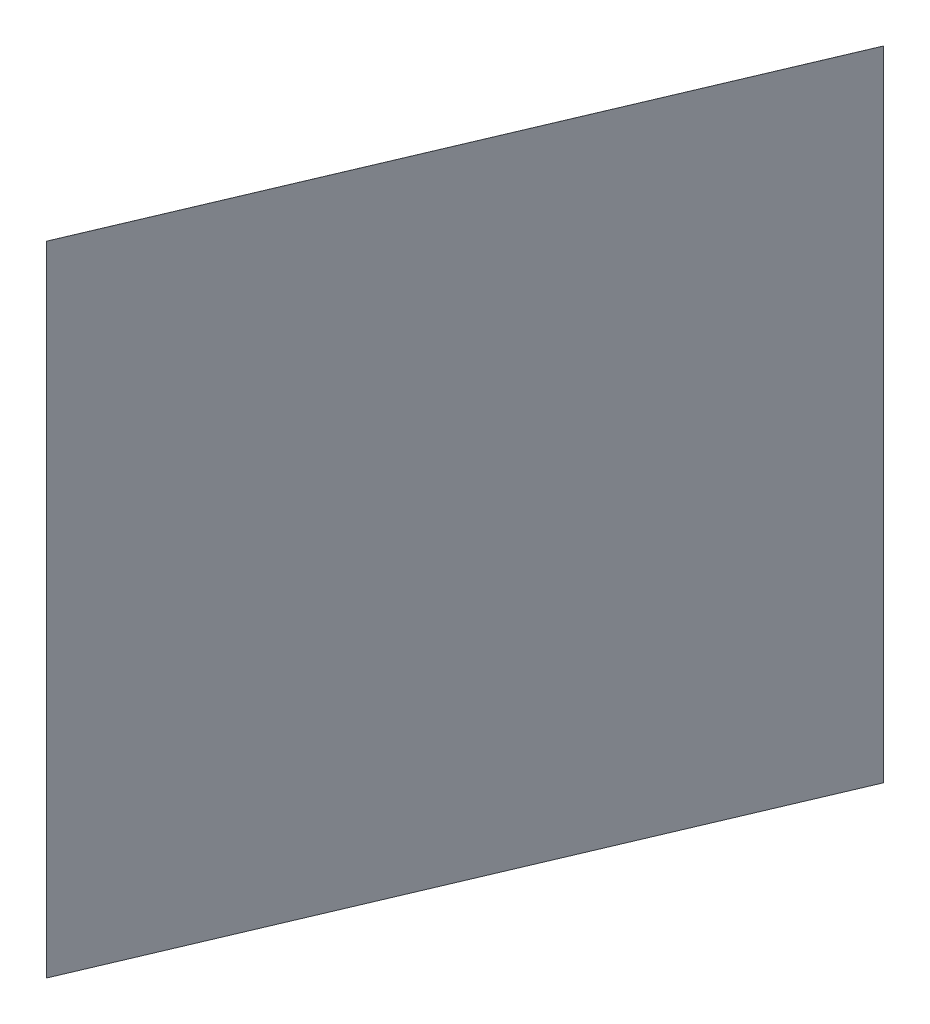
ISO-10303-21;
HEADER;
FILE_DESCRIPTION(('STEP AP214'),'2;1');
FILE_NAME('part.step','',(''),(''),'','','');
FILE_SCHEMA(('AUTOMOTIVE_DESIGN { 1 0 10303 214 1 1 1 1 }'));
ENDSEC;
DATA;
#1=APPLICATION_CONTEXT('core data for automotive mechanical design processes');
#2=APPLICATION_PROTOCOL_DEFINITION('international standard','automotive_design',2000,#1);
#3=PRODUCT_CONTEXT('',#1,'mechanical');
#4=PRODUCT('Part','Part','',(#3));
#5=PRODUCT_RELATED_PRODUCT_CATEGORY('part','',(#4));
#6=PRODUCT_DEFINITION_FORMATION('','',#4);
#7=PRODUCT_DEFINITION_CONTEXT('part definition',#1,'design');
#8=PRODUCT_DEFINITION('design','',#6,#7);
#9=PRODUCT_DEFINITION_SHAPE('','',#8);
#10=(LENGTH_UNIT() NAMED_UNIT(*) SI_UNIT(.MILLI.,.METRE.));
#11=(NAMED_UNIT(*) PLANE_ANGLE_UNIT() SI_UNIT($,.RADIAN.));
#12=(NAMED_UNIT(*) SI_UNIT($,.STERADIAN.) SOLID_ANGLE_UNIT());
#13=UNCERTAINTY_MEASURE_WITH_UNIT(LENGTH_MEASURE(1.E-05),#10,'distance_accuracy_value','');
#14=(GEOMETRIC_REPRESENTATION_CONTEXT(3) GLOBAL_UNCERTAINTY_ASSIGNED_CONTEXT((#13)) GLOBAL_UNIT_ASSIGNED_CONTEXT((#10,
#11,#12)) REPRESENTATION_CONTEXT('',''));
#15=CARTESIAN_POINT('',(0.,0.,0.));
#16=DIRECTION('',(0.,0.,1.));
#17=DIRECTION('',(1.,0.,0.));
#18=AXIS2_PLACEMENT_3D('',#15,#16,#17);
#19=CARTESIAN_POINT('',(26.3139265279684,75.,152.248217043269));
#20=DIRECTION('',(-0.390731128488764,0.,0.920504853452657));
#21=DIRECTION('',(0.,1.,0.));
#22=AXIS2_PLACEMENT_3D('',#19,#20,#21);
#23=PLANE('',#22);
#24=DIRECTION('',(0.,-1.,0.));
#25=VECTOR('',#24,1.);
#26=CARTESIAN_POINT('',(26.3139265279684,75.,152.248217043269));
#27=LINE('',#26,#25);
#28=CARTESIAN_POINT('',(26.3139265279684,75.,152.248217043269));
#29=VERTEX_POINT('',#28);
#30=CARTESIAN_POINT('',(26.3139265279683,-75.,152.24821704327));
#31=VERTEX_POINT('',#30);
#32=EDGE_CURVE('E11',#29,#31,#27,.T.);
#33=ORIENTED_EDGE('',*,*,#32,.T.);
#34=DIRECTION('',(0.920504853452657,0.,0.390731128488764));
#35=VECTOR('',#34,1.);
#36=CARTESIAN_POINT('',(26.3139265279683,-75.,152.24821704327));
#37=LINE('',#36,#35);
#38=CARTESIAN_POINT('',(26.3231315765029,-75.,152.252124354554));
#39=VERTEX_POINT('',#38);
#40=EDGE_CURVE('E27',#31,#39,#37,.T.);
#41=ORIENTED_EDGE('',*,*,#40,.T.);
#42=DIRECTION('',(0.,-1.,0.));
#43=VECTOR('',#42,1.);
#44=CARTESIAN_POINT('',(26.3231315765029,75.,152.252124354554));
#45=LINE('',#44,#43);
#46=CARTESIAN_POINT('',(26.3231315765029,75.,152.252124354554));
#47=VERTEX_POINT('',#46);
#48=EDGE_CURVE('E20',#47,#39,#45,.T.);
#49=ORIENTED_EDGE('',*,*,#48,.F.);
#50=DIRECTION('',(0.920504853452657,0.,0.390731128488764));
#51=VECTOR('',#50,1.);
#52=CARTESIAN_POINT('',(26.3139265279684,75.,152.248217043269));
#53=LINE('',#52,#51);
#54=EDGE_CURVE('E95',#29,#47,#53,.T.);
#55=ORIENTED_EDGE('',*,*,#54,.F.);
#56=EDGE_LOOP('',(#33,#41,#49,#55));
#57=FACE_BOUND('',#56,.T.);
#58=ADVANCED_FACE('F16',(#57),#23,.T.);
#59=CARTESIAN_POINT('',(84.9235958013587,75.,14.1724890254052));
#60=DIRECTION('',(0.,1.,0.));
#61=DIRECTION('',(0.,0.,-1.));
#62=AXIS2_PLACEMENT_3D('',#59,#60,#61);
#63=PLANE('',#62);
#64=DIRECTION('',(-0.390731128489274,0.,0.92050485345244));
#65=VECTOR('',#64,1.);
#66=CARTESIAN_POINT('',(84.9235958013587,75.,14.1724890254052));
#67=LINE('',#66,#65);
#68=CARTESIAN_POINT('',(84.9235958013587,75.,14.1724890254052));
#69=VERTEX_POINT('',#68);
#70=EDGE_CURVE('E99',#69,#29,#67,.T.);
#71=ORIENTED_EDGE('',*,*,#70,.T.);
#72=ORIENTED_EDGE('',*,*,#54,.T.);
#73=DIRECTION('',(-0.390731128489274,0.,0.92050485345244));
#74=VECTOR('',#73,1.);
#75=CARTESIAN_POINT('',(84.9328008498932,75.,14.1763963366901));
#76=LINE('',#75,#74);
#77=CARTESIAN_POINT('',(84.9328008498932,75.,14.1763963366901));
#78=VERTEX_POINT('',#77);
#79=EDGE_CURVE('E80',#78,#47,#76,.T.);
#80=ORIENTED_EDGE('',*,*,#79,.F.);
#81=DIRECTION('',(0.920504853452657,0.,0.390731128488764));
#82=VECTOR('',#81,1.);
#83=CARTESIAN_POINT('',(84.9235958013587,75.,14.1724890254052));
#84=LINE('',#83,#82);
#85=EDGE_CURVE('E74',#69,#78,#84,.T.);
#86=ORIENTED_EDGE('',*,*,#85,.F.);
#87=EDGE_LOOP('',(#71,#72,#80,#86));
#88=FACE_BOUND('',#87,.T.);
#89=ADVANCED_FACE('F176',(#88),#63,.T.);
#90=CARTESIAN_POINT('',(84.9235958013587,-75.,14.1724890254053));
#91=DIRECTION('',(0.390731128488764,0.,-0.920504853452657));
#92=DIRECTION('',(0.,-1.,0.));
#93=AXIS2_PLACEMENT_3D('',#90,#91,#92);
#94=PLANE('',#93);
#95=DIRECTION('',(0.,1.,0.));
#96=VECTOR('',#95,1.);
#97=CARTESIAN_POINT('',(84.9235958013587,-75.,14.1724890254053));
#98=LINE('',#97,#96);
#99=CARTESIAN_POINT('',(84.9235958013587,-75.,14.1724890254053));
#100=VERTEX_POINT('',#99);
#101=EDGE_CURVE('E100',#100,#69,#98,.T.);
#102=ORIENTED_EDGE('',*,*,#101,.T.);
#103=ORIENTED_EDGE('',*,*,#85,.T.);
#104=DIRECTION('',(0.,1.,0.));
#105=VECTOR('',#104,1.);
#106=CARTESIAN_POINT('',(84.9328008498932,-75.,14.1763963366901));
#107=LINE('',#106,#105);
#108=CARTESIAN_POINT('',(84.9328008498932,-75.,14.1763963366901));
#109=VERTEX_POINT('',#108);
#110=EDGE_CURVE('E72',#109,#78,#107,.T.);
#111=ORIENTED_EDGE('',*,*,#110,.F.);
#112=DIRECTION('',(0.920504853452657,0.,0.390731128488764));
#113=VECTOR('',#112,1.);
#114=CARTESIAN_POINT('',(84.9235958013587,-75.,14.1724890254053));
#115=LINE('',#114,#113);
#116=EDGE_CURVE('E66',#100,#109,#115,.T.);
#117=ORIENTED_EDGE('',*,*,#116,.F.);
#118=EDGE_LOOP('',(#102,#103,#111,#117));
#119=FACE_BOUND('',#118,.T.);
#120=ADVANCED_FACE('F73',(#119),#94,.T.);
#121=CARTESIAN_POINT('',(26.3139265279683,-75.,152.24821704327));
#122=DIRECTION('',(0.,-1.,0.));
#123=DIRECTION('',(-1.,0.,0.));
#124=AXIS2_PLACEMENT_3D('',#121,#122,#123);
#125=PLANE('',#124);
#126=DIRECTION('',(0.390731128489274,0.,-0.92050485345244));
#127=VECTOR('',#126,1.);
#128=CARTESIAN_POINT('',(26.3139265279683,-75.,152.24821704327));
#129=LINE('',#128,#127);
#130=EDGE_CURVE('E84',#31,#100,#129,.T.);
#131=ORIENTED_EDGE('',*,*,#130,.T.);
#132=ORIENTED_EDGE('',*,*,#116,.T.);
#133=DIRECTION('',(0.390731128489274,0.,-0.92050485345244));
#134=VECTOR('',#133,1.);
#135=CARTESIAN_POINT('',(26.3231315765029,-75.,152.252124354554));
#136=LINE('',#135,#134);
#137=EDGE_CURVE('E79',#39,#109,#136,.T.);
#138=ORIENTED_EDGE('',*,*,#137,.F.);
#139=ORIENTED_EDGE('',*,*,#40,.F.);
#140=EDGE_LOOP('',(#131,#132,#138,#139));
#141=FACE_BOUND('',#140,.T.);
#142=ADVANCED_FACE('F82',(#141),#125,.T.);
#143=CARTESIAN_POINT('',(55.6279662131598,0.,83.214260345606));
#144=DIRECTION('',(0.920504853452657,0.,0.390731128488764));
#145=DIRECTION('',(0.,-1.,0.));
#146=AXIS2_PLACEMENT_3D('',#143,#144,#145);
#147=PLANE('',#146);
#148=ORIENTED_EDGE('',*,*,#137,.T.);
#149=ORIENTED_EDGE('',*,*,#110,.T.);
#150=ORIENTED_EDGE('',*,*,#79,.T.);
#151=ORIENTED_EDGE('',*,*,#48,.T.);
#152=EDGE_LOOP('',(#148,#149,#150,#151));
#153=FACE_BOUND('',#152,.T.);
#154=ADVANCED_FACE('F87',(#153),#147,.T.);
#155=CARTESIAN_POINT('',(55.6187611646635,0.,83.2103530343373));
#156=DIRECTION('',(0.92050485345244,0.,0.390731128489274));
#157=DIRECTION('',(0.,-1.,0.));
#158=AXIS2_PLACEMENT_3D('',#155,#156,#157);
#159=PLANE('',#158);
#160=ORIENTED_EDGE('',*,*,#130,.F.);
#161=ORIENTED_EDGE('',*,*,#32,.F.);
#162=ORIENTED_EDGE('',*,*,#70,.F.);
#163=ORIENTED_EDGE('',*,*,#101,.F.);
#164=EDGE_LOOP('',(#160,#161,#162,#163));
#165=FACE_BOUND('',#164,.T.);
#166=ADVANCED_FACE('F18',(#165),#159,.F.);
#167=CLOSED_SHELL('',(#58,#89,#120,#142,#154,#166));
#168=MANIFOLD_SOLID_BREP('B1',#167);
#169=ADVANCED_BREP_SHAPE_REPRESENTATION('',(#18,#168),#14);
#170=SHAPE_DEFINITION_REPRESENTATION(#9,#169);
ENDSEC;
END-ISO-10303-21;
